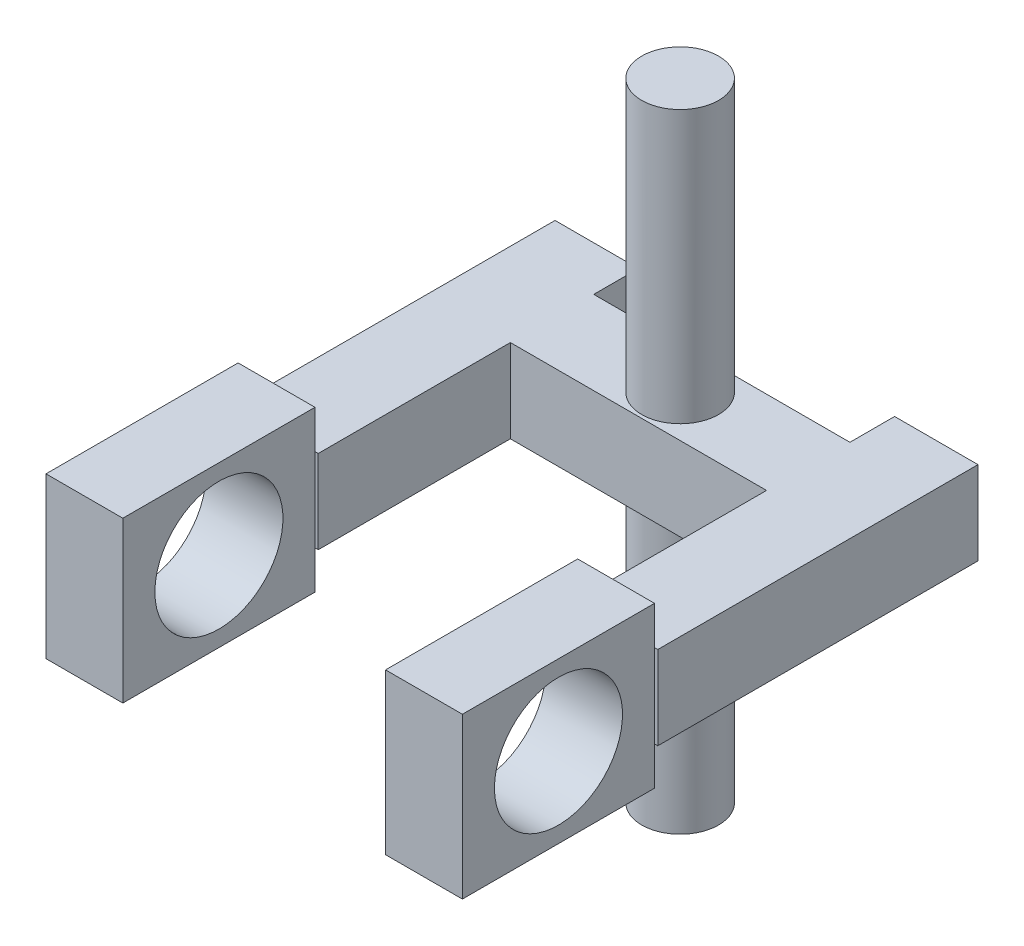
ISO-10303-21;
HEADER;
FILE_DESCRIPTION(('STEP AP214'),'2;1');
FILE_NAME('part.step','',(''),(''),'','','');
FILE_SCHEMA(('AUTOMOTIVE_DESIGN { 1 0 10303 214 1 1 1 1 }'));
ENDSEC;
DATA;
#1=APPLICATION_CONTEXT('core data for automotive mechanical design processes');
#2=APPLICATION_PROTOCOL_DEFINITION('international standard','automotive_design',2000,#1);
#3=PRODUCT_CONTEXT('',#1,'mechanical');
#4=PRODUCT('Part','Part','',(#3));
#5=PRODUCT_RELATED_PRODUCT_CATEGORY('part','',(#4));
#6=PRODUCT_DEFINITION_FORMATION('','',#4);
#7=PRODUCT_DEFINITION_CONTEXT('part definition',#1,'design');
#8=PRODUCT_DEFINITION('design','',#6,#7);
#9=PRODUCT_DEFINITION_SHAPE('','',#8);
#10=(LENGTH_UNIT() NAMED_UNIT(*) SI_UNIT(.MILLI.,.METRE.));
#11=(NAMED_UNIT(*) PLANE_ANGLE_UNIT() SI_UNIT($,.RADIAN.));
#12=(NAMED_UNIT(*) SI_UNIT($,.STERADIAN.) SOLID_ANGLE_UNIT());
#13=UNCERTAINTY_MEASURE_WITH_UNIT(LENGTH_MEASURE(1.E-05),#10,'distance_accuracy_value','');
#14=(GEOMETRIC_REPRESENTATION_CONTEXT(3) GLOBAL_UNCERTAINTY_ASSIGNED_CONTEXT((#13)) GLOBAL_UNIT_ASSIGNED_CONTEXT((#10,
#11,#12)) REPRESENTATION_CONTEXT('',''));
#15=CARTESIAN_POINT('',(0.,0.,0.));
#16=DIRECTION('',(0.,0.,1.));
#17=DIRECTION('',(1.,0.,0.));
#18=AXIS2_PLACEMENT_3D('',#15,#16,#17);
#19=CARTESIAN_POINT('',(0.,0.,36.511));
#20=DIRECTION('',(0.,0.,1.));
#21=DIRECTION('',(1.,0.,0.));
#22=AXIS2_PLACEMENT_3D('',#19,#20,#21);
#23=PLANE('',#22);
#24=DIRECTION('',(-1.,0.,0.));
#25=VECTOR('',#24,1.);
#26=CARTESIAN_POINT('',(20.,55.511,36.511));
#27=LINE('',#26,#25);
#28=CARTESIAN_POINT('',(33.022,55.511,36.511));
#29=VERTEX_POINT('',#28);
#30=CARTESIAN_POINT('',(32.511,55.511,36.511));
#31=VERTEX_POINT('',#30);
#32=EDGE_CURVE('E435',#29,#31,#27,.T.);
#33=ORIENTED_EDGE('',*,*,#32,.T.);
#34=DIRECTION('',(0.,-1.,0.));
#35=VECTOR('',#34,1.);
#36=CARTESIAN_POINT('',(32.511,0.,36.511));
#37=LINE('',#36,#35);
#38=CARTESIAN_POINT('',(32.511,42.489,36.511));
#39=VERTEX_POINT('',#38);
#40=EDGE_CURVE('E11',#31,#39,#37,.T.);
#41=ORIENTED_EDGE('',*,*,#40,.T.);
#42=DIRECTION('',(1.,0.,0.));
#43=VECTOR('',#42,1.);
#44=CARTESIAN_POINT('',(20.,42.489,36.511));
#45=LINE('',#44,#43);
#46=CARTESIAN_POINT('',(33.022,42.489,36.511));
#47=VERTEX_POINT('',#46);
#48=EDGE_CURVE('E424',#39,#47,#45,.T.);
#49=ORIENTED_EDGE('',*,*,#48,.T.);
#50=DIRECTION('',(0.,1.,0.));
#51=VECTOR('',#50,1.);
#52=CARTESIAN_POINT('',(33.022,55.511,36.511));
#53=LINE('',#52,#51);
#54=EDGE_CURVE('E429',#47,#29,#53,.T.);
#55=ORIENTED_EDGE('',*,*,#54,.T.);
#56=EDGE_LOOP('',(#33,#41,#49,#55));
#57=FACE_BOUND('',#56,.T.);
#58=ADVANCED_FACE('F41',(#57),#23,.T.);
#59=CARTESIAN_POINT('',(20.,42.489,36.511));
#60=VERTEX_POINT('',#59);
#61=CARTESIAN_POINT('',(20.511,42.489,36.511));
#62=VERTEX_POINT('',#61);
#63=EDGE_CURVE('E425',#60,#62,#45,.T.);
#64=ORIENTED_EDGE('',*,*,#63,.T.);
#65=DIRECTION('',(0.,1.,0.));
#66=VECTOR('',#65,1.);
#67=CARTESIAN_POINT('',(20.511,0.,36.511));
#68=LINE('',#67,#66);
#69=CARTESIAN_POINT('',(20.511,55.511,36.511));
#70=VERTEX_POINT('',#69);
#71=EDGE_CURVE('E51',#62,#70,#68,.T.);
#72=ORIENTED_EDGE('',*,*,#71,.T.);
#73=CARTESIAN_POINT('',(20.,55.511,36.511));
#74=VERTEX_POINT('',#73);
#75=EDGE_CURVE('E434',#70,#74,#27,.T.);
#76=ORIENTED_EDGE('',*,*,#75,.T.);
#77=DIRECTION('',(0.,-1.,0.));
#78=VECTOR('',#77,1.);
#79=CARTESIAN_POINT('',(20.,55.511,36.511));
#80=LINE('',#79,#78);
#81=EDGE_CURVE('E420',#74,#60,#80,.T.);
#82=ORIENTED_EDGE('',*,*,#81,.T.);
#83=EDGE_LOOP('',(#64,#72,#76,#82));
#84=FACE_BOUND('',#83,.T.);
#85=ADVANCED_FACE('F578',(#84),#23,.T.);
#86=CARTESIAN_POINT('',(0.,0.,36.511));
#87=DIRECTION('',(0.,0.,-1.));
#88=DIRECTION('',(-1.,0.,0.));
#89=AXIS2_PLACEMENT_3D('',#86,#87,#88);
#90=PLANE('',#89);
#91=DIRECTION('',(0.,1.,0.));
#92=VECTOR('',#91,1.);
#93=CARTESIAN_POINT('',(-20.511,0.,36.511));
#94=LINE('',#93,#92);
#95=CARTESIAN_POINT('',(-20.511,42.489,36.511));
#96=VERTEX_POINT('',#95);
#97=CARTESIAN_POINT('',(-20.511,55.511,36.511));
#98=VERTEX_POINT('',#97);
#99=EDGE_CURVE('E66',#96,#98,#94,.T.);
#100=ORIENTED_EDGE('',*,*,#99,.F.);
#101=DIRECTION('',(1.,0.,0.));
#102=VECTOR('',#101,1.);
#103=CARTESIAN_POINT('',(-20.,42.489,36.511));
#104=LINE('',#103,#102);
#105=CARTESIAN_POINT('',(-20.,42.489,36.511));
#106=VERTEX_POINT('',#105);
#107=EDGE_CURVE('E486',#96,#106,#104,.T.);
#108=ORIENTED_EDGE('',*,*,#107,.T.);
#109=DIRECTION('',(0.,1.,0.));
#110=VECTOR('',#109,1.);
#111=CARTESIAN_POINT('',(-20.,55.511,36.511));
#112=LINE('',#111,#110);
#113=CARTESIAN_POINT('',(-20.,55.511,36.511));
#114=VERTEX_POINT('',#113);
#115=EDGE_CURVE('E461',#106,#114,#112,.T.);
#116=ORIENTED_EDGE('',*,*,#115,.T.);
#117=DIRECTION('',(-1.,0.,0.));
#118=VECTOR('',#117,1.);
#119=CARTESIAN_POINT('',(-20.,55.511,36.511));
#120=LINE('',#119,#118);
#121=EDGE_CURVE('E478',#114,#98,#120,.T.);
#122=ORIENTED_EDGE('',*,*,#121,.T.);
#123=EDGE_LOOP('',(#100,#108,#116,#122));
#124=FACE_BOUND('',#123,.T.);
#125=ADVANCED_FACE('F713',(#124),#90,.F.);
#126=DIRECTION('',(0.,-1.,0.));
#127=VECTOR('',#126,1.);
#128=CARTESIAN_POINT('',(-32.511,0.,36.511));
#129=LINE('',#128,#127);
#130=CARTESIAN_POINT('',(-32.511,55.511,36.511));
#131=VERTEX_POINT('',#130);
#132=CARTESIAN_POINT('',(-32.511,42.489,36.511));
#133=VERTEX_POINT('',#132);
#134=EDGE_CURVE('E565',#131,#133,#129,.T.);
#135=ORIENTED_EDGE('',*,*,#134,.F.);
#136=CARTESIAN_POINT('',(-33.022,55.511,36.511));
#137=VERTEX_POINT('',#136);
#138=EDGE_CURVE('E477',#131,#137,#120,.T.);
#139=ORIENTED_EDGE('',*,*,#138,.T.);
#140=DIRECTION('',(0.,-1.,0.));
#141=VECTOR('',#140,1.);
#142=CARTESIAN_POINT('',(-33.022,55.511,36.511));
#143=LINE('',#142,#141);
#144=CARTESIAN_POINT('',(-33.022,42.489,36.511));
#145=VERTEX_POINT('',#144);
#146=EDGE_CURVE('E481',#137,#145,#143,.T.);
#147=ORIENTED_EDGE('',*,*,#146,.T.);
#148=EDGE_CURVE('E487',#145,#133,#104,.T.);
#149=ORIENTED_EDGE('',*,*,#148,.T.);
#150=EDGE_LOOP('',(#135,#139,#147,#149));
#151=FACE_BOUND('',#150,.T.);
#152=ADVANCED_FACE('F668',(#151),#90,.F.);
#153=CARTESIAN_POINT('',(31.962,43.549,-23.489));
#154=DIRECTION('',(1.,0.,0.));
#155=DIRECTION('',(0.,0.,-1.));
#156=AXIS2_PLACEMENT_3D('',#153,#154,#155);
#157=PLANE('',#156);
#158=DIRECTION('',(0.,1.,0.));
#159=VECTOR('',#158,1.);
#160=CARTESIAN_POINT('',(31.962,54.451,16.511));
#161=LINE('',#160,#159);
#162=CARTESIAN_POINT('',(31.962,43.549,16.511));
#163=VERTEX_POINT('',#162);
#164=CARTESIAN_POINT('',(31.962,54.451,16.511));
#165=VERTEX_POINT('',#164);
#166=EDGE_CURVE('E341',#163,#165,#161,.T.);
#167=ORIENTED_EDGE('',*,*,#166,.T.);
#168=DIRECTION('',(0.,0.,1.));
#169=VECTOR('',#168,1.);
#170=CARTESIAN_POINT('',(31.962,54.451,-23.489));
#171=LINE('',#170,#169);
#172=CARTESIAN_POINT('',(31.962,54.451,-13.489));
#173=VERTEX_POINT('',#172);
#174=EDGE_CURVE('E361',#173,#165,#171,.T.);
#175=ORIENTED_EDGE('',*,*,#174,.F.);
#176=DIRECTION('',(0.,1.,0.));
#177=VECTOR('',#176,1.);
#178=CARTESIAN_POINT('',(31.962,0.,-13.489));
#179=LINE('',#178,#177);
#180=CARTESIAN_POINT('',(31.962,43.549,-13.489));
#181=VERTEX_POINT('',#180);
#182=EDGE_CURVE('E403',#181,#173,#179,.T.);
#183=ORIENTED_EDGE('',*,*,#182,.F.);
#184=DIRECTION('',(0.,0.,1.));
#185=VECTOR('',#184,1.);
#186=CARTESIAN_POINT('',(31.962,43.549,-23.489));
#187=LINE('',#186,#185);
#188=EDGE_CURVE('E378',#181,#163,#187,.T.);
#189=ORIENTED_EDGE('',*,*,#188,.T.);
#190=EDGE_LOOP('',(#167,#175,#183,#189));
#191=FACE_BOUND('',#190,.T.);
#192=ADVANCED_FACE('F716',(#191),#157,.F.);
#193=CARTESIAN_POINT('',(21.06,43.549,-23.489));
#194=DIRECTION('',(0.,-1.,0.));
#195=DIRECTION('',(0.,0.,-1.));
#196=AXIS2_PLACEMENT_3D('',#193,#194,#195);
#197=PLANE('',#196);
#198=DIRECTION('',(1.,0.,0.));
#199=VECTOR('',#198,1.);
#200=CARTESIAN_POINT('',(21.06,43.549,16.511));
#201=LINE('',#200,#199);
#202=CARTESIAN_POINT('',(21.06,43.549,16.511));
#203=VERTEX_POINT('',#202);
#204=EDGE_CURVE('E338',#203,#163,#201,.T.);
#205=ORIENTED_EDGE('',*,*,#204,.T.);
#206=ORIENTED_EDGE('',*,*,#188,.F.);
#207=DIRECTION('',(1.,0.,0.));
#208=VECTOR('',#207,1.);
#209=CARTESIAN_POINT('',(0.,43.549,-13.489));
#210=LINE('',#209,#208);
#211=CARTESIAN_POINT('',(21.06,43.549,-13.489));
#212=VERTEX_POINT('',#211);
#213=EDGE_CURVE('E399',#212,#181,#210,.T.);
#214=ORIENTED_EDGE('',*,*,#213,.F.);
#215=DIRECTION('',(0.,0.,1.));
#216=VECTOR('',#215,1.);
#217=CARTESIAN_POINT('',(21.06,43.549,-23.489));
#218=LINE('',#217,#216);
#219=EDGE_CURVE('E382',#212,#203,#218,.T.);
#220=ORIENTED_EDGE('',*,*,#219,.T.);
#221=EDGE_LOOP('',(#205,#206,#214,#220));
#222=FACE_BOUND('',#221,.T.);
#223=ADVANCED_FACE('F1018',(#222),#197,.F.);
#224=CARTESIAN_POINT('',(21.06,43.549,-23.489));
#225=DIRECTION('',(-1.,0.,0.));
#226=DIRECTION('',(0.,0.,1.));
#227=AXIS2_PLACEMENT_3D('',#224,#225,#226);
#228=PLANE('',#227);
#229=DIRECTION('',(0.,-1.,0.));
#230=VECTOR('',#229,1.);
#231=CARTESIAN_POINT('',(21.06,54.451,16.511));
#232=LINE('',#231,#230);
#233=CARTESIAN_POINT('',(21.06,54.451,16.511));
#234=VERTEX_POINT('',#233);
#235=EDGE_CURVE('E335',#234,#203,#232,.T.);
#236=ORIENTED_EDGE('',*,*,#235,.T.);
#237=ORIENTED_EDGE('',*,*,#219,.F.);
#238=DIRECTION('',(0.,-1.,0.));
#239=VECTOR('',#238,1.);
#240=CARTESIAN_POINT('',(21.06,0.,-13.489));
#241=LINE('',#240,#239);
#242=CARTESIAN_POINT('',(21.06,54.451,-13.489));
#243=VERTEX_POINT('',#242);
#244=EDGE_CURVE('E395',#243,#212,#241,.T.);
#245=ORIENTED_EDGE('',*,*,#244,.F.);
#246=DIRECTION('',(0.,0.,1.));
#247=VECTOR('',#246,1.);
#248=CARTESIAN_POINT('',(21.06,54.451,-23.489));
#249=LINE('',#248,#247);
#250=EDGE_CURVE('E386',#243,#234,#249,.T.);
#251=ORIENTED_EDGE('',*,*,#250,.T.);
#252=EDGE_LOOP('',(#236,#237,#245,#251));
#253=FACE_BOUND('',#252,.T.);
#254=ADVANCED_FACE('F1025',(#253),#228,.F.);
#255=CARTESIAN_POINT('',(21.06,54.451,-23.489));
#256=DIRECTION('',(0.,1.,0.));
#257=DIRECTION('',(0.,0.,1.));
#258=AXIS2_PLACEMENT_3D('',#255,#256,#257);
#259=PLANE('',#258);
#260=DIRECTION('',(-1.,0.,0.));
#261=VECTOR('',#260,1.);
#262=CARTESIAN_POINT('',(21.06,54.451,16.511));
#263=LINE('',#262,#261);
#264=EDGE_CURVE('E345',#165,#234,#263,.T.);
#265=ORIENTED_EDGE('',*,*,#264,.T.);
#266=ORIENTED_EDGE('',*,*,#250,.F.);
#267=DIRECTION('',(-1.,0.,0.));
#268=VECTOR('',#267,1.);
#269=CARTESIAN_POINT('',(0.,54.451,-13.489));
#270=LINE('',#269,#268);
#271=EDGE_CURVE('E366',#173,#243,#270,.T.);
#272=ORIENTED_EDGE('',*,*,#271,.F.);
#273=ORIENTED_EDGE('',*,*,#174,.T.);
#274=EDGE_LOOP('',(#265,#266,#272,#273));
#275=FACE_BOUND('',#274,.T.);
#276=ADVANCED_FACE('F1033',(#275),#259,.F.);
#277=CARTESIAN_POINT('',(-21.06,43.549,-23.489));
#278=DIRECTION('',(1.,0.,0.));
#279=DIRECTION('',(0.,0.,-1.));
#280=AXIS2_PLACEMENT_3D('',#277,#278,#279);
#281=PLANE('',#280);
#282=DIRECTION('',(0.,1.,0.));
#283=VECTOR('',#282,1.);
#284=CARTESIAN_POINT('',(-21.06,54.451,16.511));
#285=LINE('',#284,#283);
#286=CARTESIAN_POINT('',(-21.06,43.549,16.511));
#287=VERTEX_POINT('',#286);
#288=CARTESIAN_POINT('',(-21.06,54.451,16.511));
#289=VERTEX_POINT('',#288);
#290=EDGE_CURVE('E354',#287,#289,#285,.T.);
#291=ORIENTED_EDGE('',*,*,#290,.T.);
#292=DIRECTION('',(0.,0.,1.));
#293=VECTOR('',#292,1.);
#294=CARTESIAN_POINT('',(-21.06,54.451,-23.489));
#295=LINE('',#294,#293);
#296=CARTESIAN_POINT('',(-21.06,54.451,-13.489));
#297=VERTEX_POINT('',#296);
#298=EDGE_CURVE('E375',#297,#289,#295,.T.);
#299=ORIENTED_EDGE('',*,*,#298,.F.);
#300=DIRECTION('',(0.,-1.,0.));
#301=VECTOR('',#300,1.);
#302=CARTESIAN_POINT('',(-21.06,0.,-13.489));
#303=LINE('',#302,#301);
#304=CARTESIAN_POINT('',(-21.06,43.549,-13.489));
#305=VERTEX_POINT('',#304);
#306=EDGE_CURVE('E417',#297,#305,#303,.T.);
#307=ORIENTED_EDGE('',*,*,#306,.T.);
#308=DIRECTION('',(0.,0.,1.));
#309=VECTOR('',#308,1.);
#310=CARTESIAN_POINT('',(-21.06,43.549,-23.489));
#311=LINE('',#310,#309);
#312=EDGE_CURVE('E362',#305,#287,#311,.T.);
#313=ORIENTED_EDGE('',*,*,#312,.T.);
#314=EDGE_LOOP('',(#291,#299,#307,#313));
#315=FACE_BOUND('',#314,.T.);
#316=ADVANCED_FACE('F1041',(#315),#281,.F.);
#317=CARTESIAN_POINT('',(-31.962,43.549,-23.489));
#318=DIRECTION('',(0.,-1.,0.));
#319=DIRECTION('',(0.,0.,-1.));
#320=AXIS2_PLACEMENT_3D('',#317,#318,#319);
#321=PLANE('',#320);
#322=DIRECTION('',(1.,0.,0.));
#323=VECTOR('',#322,1.);
#324=CARTESIAN_POINT('',(-31.962,43.549,16.511));
#325=LINE('',#324,#323);
#326=CARTESIAN_POINT('',(-31.962,43.549,16.511));
#327=VERTEX_POINT('',#326);
#328=EDGE_CURVE('E351',#327,#287,#325,.T.);
#329=ORIENTED_EDGE('',*,*,#328,.T.);
#330=ORIENTED_EDGE('',*,*,#312,.F.);
#331=DIRECTION('',(-1.,0.,0.));
#332=VECTOR('',#331,1.);
#333=CARTESIAN_POINT('',(0.,43.549,-13.489));
#334=LINE('',#333,#332);
#335=CARTESIAN_POINT('',(-31.962,43.549,-13.489));
#336=VERTEX_POINT('',#335);
#337=EDGE_CURVE('E414',#305,#336,#334,.T.);
#338=ORIENTED_EDGE('',*,*,#337,.T.);
#339=DIRECTION('',(0.,0.,1.));
#340=VECTOR('',#339,1.);
#341=CARTESIAN_POINT('',(-31.962,43.549,-23.489));
#342=LINE('',#341,#340);
#343=EDGE_CURVE('E367',#336,#327,#342,.T.);
#344=ORIENTED_EDGE('',*,*,#343,.T.);
#345=EDGE_LOOP('',(#329,#330,#338,#344));
#346=FACE_BOUND('',#345,.T.);
#347=ADVANCED_FACE('F1048',(#346),#321,.F.);
#348=CARTESIAN_POINT('',(-31.962,43.549,-23.489));
#349=DIRECTION('',(-1.,0.,0.));
#350=DIRECTION('',(0.,0.,1.));
#351=AXIS2_PLACEMENT_3D('',#348,#349,#350);
#352=PLANE('',#351);
#353=DIRECTION('',(0.,-1.,0.));
#354=VECTOR('',#353,1.);
#355=CARTESIAN_POINT('',(-31.962,54.451,16.511));
#356=LINE('',#355,#354);
#357=CARTESIAN_POINT('',(-31.962,54.451,16.511));
#358=VERTEX_POINT('',#357);
#359=EDGE_CURVE('E348',#358,#327,#356,.T.);
#360=ORIENTED_EDGE('',*,*,#359,.T.);
#361=ORIENTED_EDGE('',*,*,#343,.F.);
#362=DIRECTION('',(0.,1.,0.));
#363=VECTOR('',#362,1.);
#364=CARTESIAN_POINT('',(-31.962,0.,-13.489));
#365=LINE('',#364,#363);
#366=CARTESIAN_POINT('',(-31.962,54.451,-13.489));
#367=VERTEX_POINT('',#366);
#368=EDGE_CURVE('E410',#336,#367,#365,.T.);
#369=ORIENTED_EDGE('',*,*,#368,.T.);
#370=DIRECTION('',(0.,0.,1.));
#371=VECTOR('',#370,1.);
#372=CARTESIAN_POINT('',(-31.962,54.451,-23.489));
#373=LINE('',#372,#371);
#374=EDGE_CURVE('E371',#367,#358,#373,.T.);
#375=ORIENTED_EDGE('',*,*,#374,.T.);
#376=EDGE_LOOP('',(#360,#361,#369,#375));
#377=FACE_BOUND('',#376,.T.);
#378=ADVANCED_FACE('F776',(#377),#352,.F.);
#379=CARTESIAN_POINT('',(-31.962,54.451,-23.489));
#380=DIRECTION('',(0.,1.,0.));
#381=DIRECTION('',(0.,0.,1.));
#382=AXIS2_PLACEMENT_3D('',#379,#380,#381);
#383=PLANE('',#382);
#384=DIRECTION('',(-1.,0.,0.));
#385=VECTOR('',#384,1.);
#386=CARTESIAN_POINT('',(-31.962,54.451,16.511));
#387=LINE('',#386,#385);
#388=EDGE_CURVE('E358',#289,#358,#387,.T.);
#389=ORIENTED_EDGE('',*,*,#388,.T.);
#390=ORIENTED_EDGE('',*,*,#374,.F.);
#391=DIRECTION('',(1.,0.,0.));
#392=VECTOR('',#391,1.);
#393=CARTESIAN_POINT('',(0.,54.451,-13.489));
#394=LINE('',#393,#392);
#395=EDGE_CURVE('E407',#367,#297,#394,.T.);
#396=ORIENTED_EDGE('',*,*,#395,.T.);
#397=ORIENTED_EDGE('',*,*,#298,.T.);
#398=EDGE_LOOP('',(#389,#390,#396,#397));
#399=FACE_BOUND('',#398,.T.);
#400=ADVANCED_FACE('F769',(#399),#383,.F.);
#401=CARTESIAN_POINT('',(0.,98.,0.));
#402=DIRECTION('',(0.,-1.,0.));
#403=DIRECTION('',(0.,0.,-1.));
#404=AXIS2_PLACEMENT_3D('',#401,#402,#403);
#405=CYLINDRICAL_SURFACE('',#404,6.);
#406=CARTESIAN_POINT('',(0.,42.489,0.));
#407=DIRECTION('',(0.,-1.,0.));
#408=DIRECTION('',(0.,0.,-1.));
#409=AXIS2_PLACEMENT_3D('',#406,#407,#408);
#410=CIRCLE('',#409,6.);
#411=CARTESIAN_POINT('',(0.,42.489,-6.));
#412=VERTEX_POINT('',#411);
#413=EDGE_CURVE('E542',#412,#412,#410,.T.);
#414=ORIENTED_EDGE('',*,*,#413,.T.);
#415=EDGE_LOOP('',(#414));
#416=FACE_BOUND('',#415,.T.);
#417=CARTESIAN_POINT('',(0.,0.,0.));
#418=DIRECTION('',(0.,1.,0.));
#419=DIRECTION('',(0.,0.,1.));
#420=AXIS2_PLACEMENT_3D('',#417,#418,#419);
#421=CIRCLE('',#420,6.);
#422=CARTESIAN_POINT('',(0.,0.,6.));
#423=VERTEX_POINT('',#422);
#424=EDGE_CURVE('E558',#423,#423,#421,.T.);
#425=ORIENTED_EDGE('',*,*,#424,.T.);
#426=EDGE_LOOP('',(#425));
#427=FACE_BOUND('',#426,.T.);
#428=ADVANCED_FACE('F43',(#416,#427),#405,.T.);
#429=CARTESIAN_POINT('',(0.,0.,0.));
#430=DIRECTION('',(0.,1.,0.));
#431=DIRECTION('',(0.,0.,1.));
#432=AXIS2_PLACEMENT_3D('',#429,#430,#431);
#433=PLANE('',#432);
#434=ORIENTED_EDGE('',*,*,#424,.F.);
#435=EDGE_LOOP('',(#434));
#436=FACE_BOUND('',#435,.T.);
#437=ADVANCED_FACE('F756',(#436),#433,.F.);
#438=CARTESIAN_POINT('',(-20.,42.489,6.511));
#439=DIRECTION('',(0.,0.,1.));
#440=DIRECTION('',(1.,0.,0.));
#441=AXIS2_PLACEMENT_3D('',#438,#439,#440);
#442=PLANE('',#441);
#443=DIRECTION('',(1.,0.,0.));
#444=VECTOR('',#443,1.);
#445=CARTESIAN_POINT('',(-20.,55.511,6.511));
#446=LINE('',#445,#444);
#447=CARTESIAN_POINT('',(-20.,55.511,6.511));
#448=VERTEX_POINT('',#447);
#449=CARTESIAN_POINT('',(20.,55.511,6.511));
#450=VERTEX_POINT('',#449);
#451=EDGE_CURVE('E529',#448,#450,#446,.T.);
#452=ORIENTED_EDGE('',*,*,#451,.F.);
#453=DIRECTION('',(0.,1.,0.));
#454=VECTOR('',#453,1.);
#455=CARTESIAN_POINT('',(-20.,42.489,6.511));
#456=LINE('',#455,#454);
#457=CARTESIAN_POINT('',(-20.,42.489,6.511));
#458=VERTEX_POINT('',#457);
#459=EDGE_CURVE('E543',#458,#448,#456,.T.);
#460=ORIENTED_EDGE('',*,*,#459,.F.);
#461=DIRECTION('',(1.,0.,0.));
#462=VECTOR('',#461,1.);
#463=CARTESIAN_POINT('',(-20.,42.489,6.511));
#464=LINE('',#463,#462);
#465=CARTESIAN_POINT('',(20.,42.489,6.511));
#466=VERTEX_POINT('',#465);
#467=EDGE_CURVE('E528',#458,#466,#464,.T.);
#468=ORIENTED_EDGE('',*,*,#467,.T.);
#469=DIRECTION('',(0.,1.,0.));
#470=VECTOR('',#469,1.);
#471=CARTESIAN_POINT('',(20.,42.489,6.511));
#472=LINE('',#471,#470);
#473=EDGE_CURVE('E539',#466,#450,#472,.T.);
#474=ORIENTED_EDGE('',*,*,#473,.T.);
#475=EDGE_LOOP('',(#452,#460,#468,#474));
#476=FACE_BOUND('',#475,.T.);
#477=ADVANCED_FACE('F753',(#476),#442,.T.);
#478=CARTESIAN_POINT('',(-20.,42.489,-6.511));
#479=DIRECTION('',(0.,0.,-1.));
#480=DIRECTION('',(-1.,0.,0.));
#481=AXIS2_PLACEMENT_3D('',#478,#479,#480);
#482=PLANE('',#481);
#483=DIRECTION('',(-1.,0.,0.));
#484=VECTOR('',#483,1.);
#485=CARTESIAN_POINT('',(-20.,55.511,-6.511));
#486=LINE('',#485,#484);
#487=CARTESIAN_POINT('',(20.,55.511,-6.511));
#488=VERTEX_POINT('',#487);
#489=CARTESIAN_POINT('',(-20.,55.511,-6.511));
#490=VERTEX_POINT('',#489);
#491=EDGE_CURVE('E512',#488,#490,#486,.T.);
#492=ORIENTED_EDGE('',*,*,#491,.F.);
#493=DIRECTION('',(0.,1.,0.));
#494=VECTOR('',#493,1.);
#495=CARTESIAN_POINT('',(20.,42.489,-6.511));
#496=LINE('',#495,#494);
#497=CARTESIAN_POINT('',(20.,42.489,-6.511));
#498=VERTEX_POINT('',#497);
#499=EDGE_CURVE('E532',#498,#488,#496,.T.);
#500=ORIENTED_EDGE('',*,*,#499,.F.);
#501=DIRECTION('',(-1.,0.,0.));
#502=VECTOR('',#501,1.);
#503=CARTESIAN_POINT('',(-20.,42.489,-6.511));
#504=LINE('',#503,#502);
#505=CARTESIAN_POINT('',(-20.,42.489,-6.511));
#506=VERTEX_POINT('',#505);
#507=EDGE_CURVE('E525',#498,#506,#504,.T.);
#508=ORIENTED_EDGE('',*,*,#507,.T.);
#509=DIRECTION('',(0.,1.,0.));
#510=VECTOR('',#509,1.);
#511=CARTESIAN_POINT('',(-20.,42.489,-6.511));
#512=LINE('',#511,#510);
#513=EDGE_CURVE('E547',#506,#490,#512,.T.);
#514=ORIENTED_EDGE('',*,*,#513,.T.);
#515=EDGE_LOOP('',(#492,#500,#508,#514));
#516=FACE_BOUND('',#515,.T.);
#517=ADVANCED_FACE('F747',(#516),#482,.T.);
#518=CARTESIAN_POINT('',(0.,42.489,0.));
#519=DIRECTION('',(0.,-1.,0.));
#520=DIRECTION('',(0.,0.,-1.));
#521=AXIS2_PLACEMENT_3D('',#518,#519,#520);
#522=PLANE('',#521);
#523=ORIENTED_EDGE('',*,*,#413,.F.);
#524=EDGE_LOOP('',(#523));
#525=FACE_BOUND('',#524,.T.);
#526=ORIENTED_EDGE('',*,*,#507,.F.);
#527=DIRECTION('',(0.,0.,1.));
#528=VECTOR('',#527,1.);
#529=CARTESIAN_POINT('',(20.,42.489,-13.489));
#530=LINE('',#529,#528);
#531=CARTESIAN_POINT('',(20.,42.489,-13.489));
#532=VERTEX_POINT('',#531);
#533=EDGE_CURVE('E470',#532,#498,#530,.T.);
#534=ORIENTED_EDGE('',*,*,#533,.F.);
#535=DIRECTION('',(1.,0.,0.));
#536=VECTOR('',#535,1.);
#537=CARTESIAN_POINT('',(20.,42.489,-13.489));
#538=LINE('',#537,#536);
#539=CARTESIAN_POINT('',(33.022,42.489,-13.489));
#540=VERTEX_POINT('',#539);
#541=EDGE_CURVE('E444',#532,#540,#538,.T.);
#542=ORIENTED_EDGE('',*,*,#541,.T.);
#543=DIRECTION('',(0.,0.,1.));
#544=VECTOR('',#543,1.);
#545=CARTESIAN_POINT('',(33.022,42.489,-13.489));
#546=LINE('',#545,#544);
#547=EDGE_CURVE('E466',#540,#47,#546,.T.);
#548=ORIENTED_EDGE('',*,*,#547,.T.);
#549=ORIENTED_EDGE('',*,*,#48,.F.);
#550=EDGE_CURVE('E430',#62,#39,#45,.T.);
#551=ORIENTED_EDGE('',*,*,#550,.F.);
#552=ORIENTED_EDGE('',*,*,#63,.F.);
#553=EDGE_CURVE('E456',#466,#60,#530,.T.);
#554=ORIENTED_EDGE('',*,*,#553,.F.);
#555=ORIENTED_EDGE('',*,*,#467,.F.);
#556=DIRECTION('',(0.,0.,1.));
#557=VECTOR('',#556,1.);
#558=CARTESIAN_POINT('',(-20.,42.489,-13.489));
#559=LINE('',#558,#557);
#560=EDGE_CURVE('E513',#458,#106,#559,.T.);
#561=ORIENTED_EDGE('',*,*,#560,.T.);
#562=ORIENTED_EDGE('',*,*,#107,.F.);
#563=EDGE_CURVE('E491',#133,#96,#104,.T.);
#564=ORIENTED_EDGE('',*,*,#563,.F.);
#565=ORIENTED_EDGE('',*,*,#148,.F.);
#566=DIRECTION('',(0.,0.,1.));
#567=VECTOR('',#566,1.);
#568=CARTESIAN_POINT('',(-33.022,42.489,-13.489));
#569=LINE('',#568,#567);
#570=CARTESIAN_POINT('',(-33.022,42.489,-13.489));
#571=VERTEX_POINT('',#570);
#572=EDGE_CURVE('E514',#571,#145,#569,.T.);
#573=ORIENTED_EDGE('',*,*,#572,.F.);
#574=DIRECTION('',(1.,0.,0.));
#575=VECTOR('',#574,1.);
#576=CARTESIAN_POINT('',(-20.,42.489,-13.489));
#577=LINE('',#576,#575);
#578=CARTESIAN_POINT('',(-20.,42.489,-13.489));
#579=VERTEX_POINT('',#578);
#580=EDGE_CURVE('E503',#571,#579,#577,.T.);
#581=ORIENTED_EDGE('',*,*,#580,.T.);
#582=EDGE_CURVE('E508',#579,#506,#559,.T.);
#583=ORIENTED_EDGE('',*,*,#582,.T.);
#584=EDGE_LOOP('',(#526,#534,#542,#548,#549,#551,#552,#554,#555,#561,#562,#564,#565,#573,#581,#583));
#585=FACE_BOUND('',#584,.T.);
#586=ADVANCED_FACE('F602',(#525,#585),#522,.T.);
#587=CARTESIAN_POINT('',(0.,55.511,0.));
#588=DIRECTION('',(0.,-1.,0.));
#589=DIRECTION('',(0.,0.,-1.));
#590=AXIS2_PLACEMENT_3D('',#587,#588,#589);
#591=PLANE('',#590);
#592=CARTESIAN_POINT('',(0.,55.511,0.));
#593=DIRECTION('',(0.,-1.,0.));
#594=DIRECTION('',(0.,0.,-1.));
#595=AXIS2_PLACEMENT_3D('',#592,#593,#594);
#596=CIRCLE('',#595,6.);
#597=CARTESIAN_POINT('',(0.,55.511,-6.));
#598=VERTEX_POINT('',#597);
#599=EDGE_CURVE('E557',#598,#598,#596,.T.);
#600=ORIENTED_EDGE('',*,*,#599,.T.);
#601=EDGE_LOOP('',(#600));
#602=FACE_BOUND('',#601,.T.);
#603=ORIENTED_EDGE('',*,*,#451,.T.);
#604=DIRECTION('',(0.,0.,1.));
#605=VECTOR('',#604,1.);
#606=CARTESIAN_POINT('',(20.,55.511,-13.489));
#607=LINE('',#606,#605);
#608=EDGE_CURVE('E462',#450,#74,#607,.T.);
#609=ORIENTED_EDGE('',*,*,#608,.T.);
#610=ORIENTED_EDGE('',*,*,#75,.F.);
#611=EDGE_CURVE('E440',#31,#70,#27,.T.);
#612=ORIENTED_EDGE('',*,*,#611,.F.);
#613=ORIENTED_EDGE('',*,*,#32,.F.);
#614=DIRECTION('',(0.,0.,1.));
#615=VECTOR('',#614,1.);
#616=CARTESIAN_POINT('',(33.022,55.511,-13.489));
#617=LINE('',#616,#615);
#618=CARTESIAN_POINT('',(33.022,55.511,-13.489));
#619=VERTEX_POINT('',#618);
#620=EDGE_CURVE('E463',#619,#29,#617,.T.);
#621=ORIENTED_EDGE('',*,*,#620,.F.);
#622=DIRECTION('',(-1.,0.,0.));
#623=VECTOR('',#622,1.);
#624=CARTESIAN_POINT('',(20.,55.511,-13.489));
#625=LINE('',#624,#623);
#626=CARTESIAN_POINT('',(20.,55.511,-13.489));
#627=VERTEX_POINT('',#626);
#628=EDGE_CURVE('E452',#619,#627,#625,.T.);
#629=ORIENTED_EDGE('',*,*,#628,.T.);
#630=EDGE_CURVE('E457',#627,#488,#607,.T.);
#631=ORIENTED_EDGE('',*,*,#630,.T.);
#632=ORIENTED_EDGE('',*,*,#491,.T.);
#633=DIRECTION('',(0.,0.,1.));
#634=VECTOR('',#633,1.);
#635=CARTESIAN_POINT('',(-20.,55.511,-13.489));
#636=LINE('',#635,#634);
#637=CARTESIAN_POINT('',(-20.,55.511,-13.489));
#638=VERTEX_POINT('',#637);
#639=EDGE_CURVE('E521',#638,#490,#636,.T.);
#640=ORIENTED_EDGE('',*,*,#639,.F.);
#641=DIRECTION('',(-1.,0.,0.));
#642=VECTOR('',#641,1.);
#643=CARTESIAN_POINT('',(-20.,55.511,-13.489));
#644=LINE('',#643,#642);
#645=CARTESIAN_POINT('',(-33.022,55.511,-13.489));
#646=VERTEX_POINT('',#645);
#647=EDGE_CURVE('E495',#638,#646,#644,.T.);
#648=ORIENTED_EDGE('',*,*,#647,.T.);
#649=DIRECTION('',(0.,0.,1.));
#650=VECTOR('',#649,1.);
#651=CARTESIAN_POINT('',(-33.022,55.511,-13.489));
#652=LINE('',#651,#650);
#653=EDGE_CURVE('E517',#646,#137,#652,.T.);
#654=ORIENTED_EDGE('',*,*,#653,.T.);
#655=ORIENTED_EDGE('',*,*,#138,.F.);
#656=EDGE_CURVE('E482',#98,#131,#120,.T.);
#657=ORIENTED_EDGE('',*,*,#656,.F.);
#658=ORIENTED_EDGE('',*,*,#121,.F.);
#659=EDGE_CURVE('E507',#448,#114,#636,.T.);
#660=ORIENTED_EDGE('',*,*,#659,.F.);
#661=EDGE_LOOP('',(#603,#609,#610,#612,#613,#621,#629,#631,#632,#640,#648,#654,#655,#657,#658,#660));
#662=FACE_BOUND('',#661,.T.);
#663=ADVANCED_FACE('F584',(#602,#662),#591,.F.);
#664=CARTESIAN_POINT('',(0.,98.,0.));
#665=DIRECTION('',(0.,1.,0.));
#666=DIRECTION('',(0.,0.,1.));
#667=AXIS2_PLACEMENT_3D('',#664,#665,#666);
#668=PLANE('',#667);
#669=CARTESIAN_POINT('',(0.,98.,0.));
#670=DIRECTION('',(0.,1.,0.));
#671=DIRECTION('',(0.,0.,1.));
#672=AXIS2_PLACEMENT_3D('',#669,#670,#671);
#673=CIRCLE('',#672,6.);
#674=CARTESIAN_POINT('',(0.,98.,6.));
#675=VERTEX_POINT('',#674);
#676=EDGE_CURVE('E553',#675,#675,#673,.T.);
#677=ORIENTED_EDGE('',*,*,#676,.T.);
#678=EDGE_LOOP('',(#677));
#679=FACE_BOUND('',#678,.T.);
#680=ADVANCED_FACE('F751',(#679),#668,.T.);
#681=ORIENTED_EDGE('',*,*,#676,.F.);
#682=EDGE_LOOP('',(#681));
#683=FACE_BOUND('',#682,.T.);
#684=ORIENTED_EDGE('',*,*,#599,.F.);
#685=EDGE_LOOP('',(#684));
#686=FACE_BOUND('',#685,.T.);
#687=ADVANCED_FACE('F762',(#683,#686),#405,.T.);
#688=CARTESIAN_POINT('',(-20.,55.511,-13.489));
#689=DIRECTION('',(1.,0.,0.));
#690=DIRECTION('',(0.,0.,-1.));
#691=AXIS2_PLACEMENT_3D('',#688,#689,#690);
#692=PLANE('',#691);
#693=ORIENTED_EDGE('',*,*,#513,.F.);
#694=ORIENTED_EDGE('',*,*,#582,.F.);
#695=DIRECTION('',(0.,1.,0.));
#696=VECTOR('',#695,1.);
#697=CARTESIAN_POINT('',(-20.,55.511,-13.489));
#698=LINE('',#697,#696);
#699=EDGE_CURVE('E490',#579,#638,#698,.T.);
#700=ORIENTED_EDGE('',*,*,#699,.T.);
#701=ORIENTED_EDGE('',*,*,#639,.T.);
#702=EDGE_LOOP('',(#693,#694,#700,#701));
#703=FACE_BOUND('',#702,.T.);
#704=ADVANCED_FACE('F743',(#703),#692,.T.);
#705=ORIENTED_EDGE('',*,*,#560,.F.);
#706=ORIENTED_EDGE('',*,*,#459,.T.);
#707=ORIENTED_EDGE('',*,*,#659,.T.);
#708=ORIENTED_EDGE('',*,*,#115,.F.);
#709=EDGE_LOOP('',(#705,#706,#707,#708));
#710=FACE_BOUND('',#709,.T.);
#711=ADVANCED_FACE('F740',(#710),#692,.T.);
#712=CARTESIAN_POINT('',(-33.022,55.511,-13.489));
#713=DIRECTION('',(-1.,0.,0.));
#714=DIRECTION('',(0.,-1.,0.));
#715=AXIS2_PLACEMENT_3D('',#712,#713,#714);
#716=PLANE('',#715);
#717=ORIENTED_EDGE('',*,*,#572,.T.);
#718=ORIENTED_EDGE('',*,*,#146,.F.);
#719=ORIENTED_EDGE('',*,*,#653,.F.);
#720=DIRECTION('',(0.,-1.,0.));
#721=VECTOR('',#720,1.);
#722=CARTESIAN_POINT('',(-33.022,55.511,-13.489));
#723=LINE('',#722,#721);
#724=EDGE_CURVE('E499',#646,#571,#723,.T.);
#725=ORIENTED_EDGE('',*,*,#724,.T.);
#726=EDGE_LOOP('',(#717,#718,#719,#725));
#727=FACE_BOUND('',#726,.T.);
#728=ADVANCED_FACE('F674',(#727),#716,.T.);
#729=CARTESIAN_POINT('',(0.,0.,-13.489));
#730=DIRECTION('',(0.,0.,-1.));
#731=DIRECTION('',(-1.,0.,0.));
#732=AXIS2_PLACEMENT_3D('',#729,#730,#731);
#733=PLANE('',#732);
#734=ORIENTED_EDGE('',*,*,#306,.F.);
#735=ORIENTED_EDGE('',*,*,#395,.F.);
#736=ORIENTED_EDGE('',*,*,#368,.F.);
#737=ORIENTED_EDGE('',*,*,#337,.F.);
#738=EDGE_LOOP('',(#734,#735,#736,#737));
#739=FACE_BOUND('',#738,.T.);
#740=ORIENTED_EDGE('',*,*,#699,.F.);
#741=ORIENTED_EDGE('',*,*,#580,.F.);
#742=ORIENTED_EDGE('',*,*,#724,.F.);
#743=ORIENTED_EDGE('',*,*,#647,.F.);
#744=EDGE_LOOP('',(#740,#741,#742,#743));
#745=FACE_BOUND('',#744,.T.);
#746=ADVANCED_FACE('F734',(#739,#745),#733,.T.);
#747=CARTESIAN_POINT('',(20.,55.511,-13.489));
#748=DIRECTION('',(-1.,0.,0.));
#749=DIRECTION('',(0.,0.,1.));
#750=AXIS2_PLACEMENT_3D('',#747,#748,#749);
#751=PLANE('',#750);
#752=ORIENTED_EDGE('',*,*,#473,.F.);
#753=ORIENTED_EDGE('',*,*,#553,.T.);
#754=ORIENTED_EDGE('',*,*,#81,.F.);
#755=ORIENTED_EDGE('',*,*,#608,.F.);
#756=EDGE_LOOP('',(#752,#753,#754,#755));
#757=FACE_BOUND('',#756,.T.);
#758=ADVANCED_FACE('F730',(#757),#751,.T.);
#759=ORIENTED_EDGE('',*,*,#533,.T.);
#760=ORIENTED_EDGE('',*,*,#499,.T.);
#761=ORIENTED_EDGE('',*,*,#630,.F.);
#762=DIRECTION('',(0.,-1.,0.));
#763=VECTOR('',#762,1.);
#764=CARTESIAN_POINT('',(20.,55.511,-13.489));
#765=LINE('',#764,#763);
#766=EDGE_CURVE('E439',#627,#532,#765,.T.);
#767=ORIENTED_EDGE('',*,*,#766,.T.);
#768=EDGE_LOOP('',(#759,#760,#761,#767));
#769=FACE_BOUND('',#768,.T.);
#770=ADVANCED_FACE('F726',(#769),#751,.T.);
#771=CARTESIAN_POINT('',(33.022,55.511,-13.489));
#772=DIRECTION('',(1.,0.,0.));
#773=DIRECTION('',(0.,1.,0.));
#774=AXIS2_PLACEMENT_3D('',#771,#772,#773);
#775=PLANE('',#774);
#776=ORIENTED_EDGE('',*,*,#620,.T.);
#777=ORIENTED_EDGE('',*,*,#54,.F.);
#778=ORIENTED_EDGE('',*,*,#547,.F.);
#779=DIRECTION('',(0.,1.,0.));
#780=VECTOR('',#779,1.);
#781=CARTESIAN_POINT('',(33.022,55.511,-13.489));
#782=LINE('',#781,#780);
#783=EDGE_CURVE('E448',#540,#619,#782,.T.);
#784=ORIENTED_EDGE('',*,*,#783,.T.);
#785=EDGE_LOOP('',(#776,#777,#778,#784));
#786=FACE_BOUND('',#785,.T.);
#787=ADVANCED_FACE('F722',(#786),#775,.T.);
#788=CARTESIAN_POINT('',(0.,0.,-13.489));
#789=DIRECTION('',(0.,0.,1.));
#790=DIRECTION('',(1.,0.,0.));
#791=AXIS2_PLACEMENT_3D('',#788,#789,#790);
#792=PLANE('',#791);
#793=ORIENTED_EDGE('',*,*,#213,.T.);
#794=ORIENTED_EDGE('',*,*,#182,.T.);
#795=ORIENTED_EDGE('',*,*,#271,.T.);
#796=ORIENTED_EDGE('',*,*,#244,.T.);
#797=EDGE_LOOP('',(#793,#794,#795,#796));
#798=FACE_BOUND('',#797,.T.);
#799=ORIENTED_EDGE('',*,*,#766,.F.);
#800=ORIENTED_EDGE('',*,*,#628,.F.);
#801=ORIENTED_EDGE('',*,*,#783,.F.);
#802=ORIENTED_EDGE('',*,*,#541,.F.);
#803=EDGE_LOOP('',(#799,#800,#801,#802));
#804=FACE_BOUND('',#803,.T.);
#805=ADVANCED_FACE('F718',(#798,#804),#792,.F.);
#806=CARTESIAN_POINT('',(0.,0.,16.511));
#807=DIRECTION('',(0.,0.,1.));
#808=DIRECTION('',(1.,0.,0.));
#809=AXIS2_PLACEMENT_3D('',#806,#807,#808);
#810=PLANE('',#809);
#811=ORIENTED_EDGE('',*,*,#359,.F.);
#812=ORIENTED_EDGE('',*,*,#388,.F.);
#813=ORIENTED_EDGE('',*,*,#290,.F.);
#814=ORIENTED_EDGE('',*,*,#328,.F.);
#815=EDGE_LOOP('',(#811,#812,#813,#814));
#816=FACE_BOUND('',#815,.T.);
#817=ADVANCED_FACE('F721',(#816),#810,.F.);
#818=CARTESIAN_POINT('',(0.,0.,16.511));
#819=DIRECTION('',(0.,0.,1.));
#820=DIRECTION('',(1.,0.,0.));
#821=AXIS2_PLACEMENT_3D('',#818,#819,#820);
#822=PLANE('',#821);
#823=ORIENTED_EDGE('',*,*,#235,.F.);
#824=ORIENTED_EDGE('',*,*,#264,.F.);
#825=ORIENTED_EDGE('',*,*,#166,.F.);
#826=ORIENTED_EDGE('',*,*,#204,.F.);
#827=EDGE_LOOP('',(#823,#824,#825,#826));
#828=FACE_BOUND('',#827,.T.);
#829=ADVANCED_FACE('F705',(#828),#822,.F.);
#830=CARTESIAN_POINT('',(0.,0.,36.511));
#831=DIRECTION('',(0.,0.,-1.));
#832=DIRECTION('',(-1.,0.,0.));
#833=AXIS2_PLACEMENT_3D('',#830,#831,#832);
#834=PLANE('',#833);
#835=ORIENTED_EDGE('',*,*,#656,.T.);
#836=DIRECTION('',(0.,-1.,0.));
#837=VECTOR('',#836,1.);
#838=CARTESIAN_POINT('',(-32.511,36.5,36.511));
#839=LINE('',#838,#837);
#840=CARTESIAN_POINT('',(-32.511,61.5,36.511));
#841=VERTEX_POINT('',#840);
#842=EDGE_CURVE('E314',#841,#131,#839,.T.);
#843=ORIENTED_EDGE('',*,*,#842,.F.);
#844=DIRECTION('',(-1.,0.,0.));
#845=VECTOR('',#844,1.);
#846=CARTESIAN_POINT('',(-32.511,61.5,36.511));
#847=LINE('',#846,#845);
#848=CARTESIAN_POINT('',(-20.511,61.5,36.511));
#849=VERTEX_POINT('',#848);
#850=EDGE_CURVE('E310',#849,#841,#847,.T.);
#851=ORIENTED_EDGE('',*,*,#850,.F.);
#852=DIRECTION('',(0.,1.,0.));
#853=VECTOR('',#852,1.);
#854=CARTESIAN_POINT('',(-20.511,36.5,36.511));
#855=LINE('',#854,#853);
#856=EDGE_CURVE('E283',#98,#849,#855,.T.);
#857=ORIENTED_EDGE('',*,*,#856,.F.);
#858=EDGE_LOOP('',(#835,#843,#851,#857));
#859=FACE_BOUND('',#858,.T.);
#860=ADVANCED_FACE('F661',(#859),#834,.T.);
#861=CARTESIAN_POINT('',(-20.511,36.5,66.511));
#862=DIRECTION('',(-1.,0.,0.));
#863=DIRECTION('',(0.,0.,1.));
#864=AXIS2_PLACEMENT_3D('',#861,#862,#863);
#865=PLANE('',#864);
#866=CARTESIAN_POINT('',(-20.511,49.,51.511));
#867=DIRECTION('',(-1.,0.,0.));
#868=DIRECTION('',(0.,0.,1.));
#869=AXIS2_PLACEMENT_3D('',#866,#867,#868);
#870=CIRCLE('',#869,10.);
#871=CARTESIAN_POINT('',(-20.511,49.,61.511));
#872=VERTEX_POINT('',#871);
#873=EDGE_CURVE('E595',#872,#872,#870,.T.);
#874=ORIENTED_EDGE('',*,*,#873,.T.);
#875=EDGE_LOOP('',(#874));
#876=FACE_BOUND('',#875,.T.);
#877=CARTESIAN_POINT('',(-20.511,36.5,36.511));
#878=VERTEX_POINT('',#877);
#879=EDGE_CURVE('E287',#878,#96,#855,.T.);
#880=ORIENTED_EDGE('',*,*,#879,.T.);
#881=ORIENTED_EDGE('',*,*,#99,.T.);
#882=ORIENTED_EDGE('',*,*,#856,.T.);
#883=DIRECTION('',(0.,0.,-1.));
#884=VECTOR('',#883,1.);
#885=CARTESIAN_POINT('',(-20.511,61.5,66.511));
#886=LINE('',#885,#884);
#887=CARTESIAN_POINT('',(-20.511,61.5,66.511));
#888=VERTEX_POINT('',#887);
#889=EDGE_CURVE('E331',#888,#849,#886,.T.);
#890=ORIENTED_EDGE('',*,*,#889,.F.);
#891=DIRECTION('',(0.,1.,0.));
#892=VECTOR('',#891,1.);
#893=CARTESIAN_POINT('',(-20.511,36.5,66.511));
#894=LINE('',#893,#892);
#895=CARTESIAN_POINT('',(-20.511,36.5,66.511));
#896=VERTEX_POINT('',#895);
#897=EDGE_CURVE('E293',#896,#888,#894,.T.);
#898=ORIENTED_EDGE('',*,*,#897,.F.);
#899=DIRECTION('',(0.,0.,-1.));
#900=VECTOR('',#899,1.);
#901=CARTESIAN_POINT('',(-20.511,36.5,66.511));
#902=LINE('',#901,#900);
#903=EDGE_CURVE('E306',#896,#878,#902,.T.);
#904=ORIENTED_EDGE('',*,*,#903,.T.);
#905=EDGE_LOOP('',(#880,#881,#882,#890,#898,#904));
#906=FACE_BOUND('',#905,.T.);
#907=ADVANCED_FACE('F696',(#876,#906),#865,.F.);
#908=CARTESIAN_POINT('',(-32.511,61.5,66.511));
#909=DIRECTION('',(0.,-1.,0.));
#910=DIRECTION('',(0.,0.,-1.));
#911=AXIS2_PLACEMENT_3D('',#908,#909,#910);
#912=PLANE('',#911);
#913=ORIENTED_EDGE('',*,*,#850,.T.);
#914=DIRECTION('',(0.,0.,-1.));
#915=VECTOR('',#914,1.);
#916=CARTESIAN_POINT('',(-32.511,61.5,66.511));
#917=LINE('',#916,#915);
#918=CARTESIAN_POINT('',(-32.511,61.5,66.511));
#919=VERTEX_POINT('',#918);
#920=EDGE_CURVE('E327',#919,#841,#917,.T.);
#921=ORIENTED_EDGE('',*,*,#920,.F.);
#922=DIRECTION('',(-1.,0.,0.));
#923=VECTOR('',#922,1.);
#924=CARTESIAN_POINT('',(-32.511,61.5,66.511));
#925=LINE('',#924,#923);
#926=EDGE_CURVE('E297',#888,#919,#925,.T.);
#927=ORIENTED_EDGE('',*,*,#926,.F.);
#928=ORIENTED_EDGE('',*,*,#889,.T.);
#929=EDGE_LOOP('',(#913,#921,#927,#928));
#930=FACE_BOUND('',#929,.T.);
#931=ADVANCED_FACE('F653',(#930),#912,.F.);
#932=CARTESIAN_POINT('',(-32.511,36.5,66.511));
#933=DIRECTION('',(1.,0.,0.));
#934=DIRECTION('',(0.,0.,-1.));
#935=AXIS2_PLACEMENT_3D('',#932,#933,#934);
#936=PLANE('',#935);
#937=CARTESIAN_POINT('',(-32.511,49.,51.511));
#938=DIRECTION('',(-1.,0.,0.));
#939=DIRECTION('',(0.,0.,1.));
#940=AXIS2_PLACEMENT_3D('',#937,#938,#939);
#941=CIRCLE('',#940,10.);
#942=CARTESIAN_POINT('',(-32.511,49.,61.511));
#943=VERTEX_POINT('',#942);
#944=EDGE_CURVE('E641',#943,#943,#941,.T.);
#945=ORIENTED_EDGE('',*,*,#944,.F.);
#946=EDGE_LOOP('',(#945));
#947=FACE_BOUND('',#946,.T.);
#948=ORIENTED_EDGE('',*,*,#842,.T.);
#949=ORIENTED_EDGE('',*,*,#134,.T.);
#950=CARTESIAN_POINT('',(-32.511,36.5,36.511));
#951=VERTEX_POINT('',#950);
#952=EDGE_CURVE('E313',#133,#951,#839,.T.);
#953=ORIENTED_EDGE('',*,*,#952,.T.);
#954=DIRECTION('',(0.,0.,-1.));
#955=VECTOR('',#954,1.);
#956=CARTESIAN_POINT('',(-32.511,36.5,66.511));
#957=LINE('',#956,#955);
#958=CARTESIAN_POINT('',(-32.511,36.5,66.511));
#959=VERTEX_POINT('',#958);
#960=EDGE_CURVE('E323',#959,#951,#957,.T.);
#961=ORIENTED_EDGE('',*,*,#960,.F.);
#962=DIRECTION('',(0.,-1.,0.));
#963=VECTOR('',#962,1.);
#964=CARTESIAN_POINT('',(-32.511,36.5,66.511));
#965=LINE('',#964,#963);
#966=EDGE_CURVE('E301',#919,#959,#965,.T.);
#967=ORIENTED_EDGE('',*,*,#966,.F.);
#968=ORIENTED_EDGE('',*,*,#920,.T.);
#969=EDGE_LOOP('',(#948,#949,#953,#961,#967,#968));
#970=FACE_BOUND('',#969,.T.);
#971=ADVANCED_FACE('F649',(#947,#970),#936,.F.);
#972=CARTESIAN_POINT('',(-32.511,36.5,66.511));
#973=DIRECTION('',(0.,1.,0.));
#974=DIRECTION('',(0.,0.,1.));
#975=AXIS2_PLACEMENT_3D('',#972,#973,#974);
#976=PLANE('',#975);
#977=DIRECTION('',(1.,0.,0.));
#978=VECTOR('',#977,1.);
#979=CARTESIAN_POINT('',(-32.511,36.5,36.511));
#980=LINE('',#979,#978);
#981=EDGE_CURVE('E298',#951,#878,#980,.T.);
#982=ORIENTED_EDGE('',*,*,#981,.T.);
#983=ORIENTED_EDGE('',*,*,#903,.F.);
#984=DIRECTION('',(1.,0.,0.));
#985=VECTOR('',#984,1.);
#986=CARTESIAN_POINT('',(-32.511,36.5,66.511));
#987=LINE('',#986,#985);
#988=EDGE_CURVE('E304',#959,#896,#987,.T.);
#989=ORIENTED_EDGE('',*,*,#988,.F.);
#990=ORIENTED_EDGE('',*,*,#960,.T.);
#991=EDGE_LOOP('',(#982,#983,#989,#990));
#992=FACE_BOUND('',#991,.T.);
#993=ADVANCED_FACE('F652',(#992),#976,.F.);
#994=CARTESIAN_POINT('',(0.,0.,66.511));
#995=DIRECTION('',(0.,0.,-1.));
#996=DIRECTION('',(-1.,0.,0.));
#997=AXIS2_PLACEMENT_3D('',#994,#995,#996);
#998=PLANE('',#997);
#999=ORIENTED_EDGE('',*,*,#897,.T.);
#1000=ORIENTED_EDGE('',*,*,#926,.T.);
#1001=ORIENTED_EDGE('',*,*,#966,.T.);
#1002=ORIENTED_EDGE('',*,*,#988,.T.);
#1003=EDGE_LOOP('',(#999,#1000,#1001,#1002));
#1004=FACE_BOUND('',#1003,.T.);
#1005=ADVANCED_FACE('F692',(#1004),#998,.F.);
#1006=ORIENTED_EDGE('',*,*,#952,.F.);
#1007=ORIENTED_EDGE('',*,*,#563,.T.);
#1008=ORIENTED_EDGE('',*,*,#879,.F.);
#1009=ORIENTED_EDGE('',*,*,#981,.F.);
#1010=EDGE_LOOP('',(#1006,#1007,#1008,#1009));
#1011=FACE_BOUND('',#1010,.T.);
#1012=ADVANCED_FACE('F684',(#1011),#834,.T.);
#1013=CARTESIAN_POINT('',(0.,0.,36.511));
#1014=DIRECTION('',(0.,0.,-1.));
#1015=DIRECTION('',(-1.,0.,0.));
#1016=AXIS2_PLACEMENT_3D('',#1013,#1014,#1015);
#1017=PLANE('',#1016);
#1018=ORIENTED_EDGE('',*,*,#611,.T.);
#1019=DIRECTION('',(0.,-1.,0.));
#1020=VECTOR('',#1019,1.);
#1021=CARTESIAN_POINT('',(20.511,36.5,36.511));
#1022=LINE('',#1021,#1020);
#1023=CARTESIAN_POINT('',(20.511,61.5,36.511));
#1024=VERTEX_POINT('',#1023);
#1025=EDGE_CURVE('E58',#1024,#70,#1022,.T.);
#1026=ORIENTED_EDGE('',*,*,#1025,.F.);
#1027=DIRECTION('',(-1.,0.,0.));
#1028=VECTOR('',#1027,1.);
#1029=CARTESIAN_POINT('',(20.511,61.5,36.511));
#1030=LINE('',#1029,#1028);
#1031=CARTESIAN_POINT('',(32.511,61.5,36.511));
#1032=VERTEX_POINT('',#1031);
#1033=EDGE_CURVE('E592',#1032,#1024,#1030,.T.);
#1034=ORIENTED_EDGE('',*,*,#1033,.F.);
#1035=DIRECTION('',(0.,1.,0.));
#1036=VECTOR('',#1035,1.);
#1037=CARTESIAN_POINT('',(32.511,36.5,36.511));
#1038=LINE('',#1037,#1036);
#1039=EDGE_CURVE('E280',#31,#1032,#1038,.T.);
#1040=ORIENTED_EDGE('',*,*,#1039,.F.);
#1041=EDGE_LOOP('',(#1018,#1026,#1034,#1040));
#1042=FACE_BOUND('',#1041,.T.);
#1043=ADVANCED_FACE('F591',(#1042),#1017,.T.);
#1044=CARTESIAN_POINT('',(32.511,36.5,66.511));
#1045=DIRECTION('',(-1.,0.,0.));
#1046=DIRECTION('',(0.,0.,1.));
#1047=AXIS2_PLACEMENT_3D('',#1044,#1045,#1046);
#1048=PLANE('',#1047);
#1049=CARTESIAN_POINT('',(32.511,49.,51.511));
#1050=DIRECTION('',(-1.,0.,0.));
#1051=DIRECTION('',(0.,0.,1.));
#1052=AXIS2_PLACEMENT_3D('',#1049,#1050,#1051);
#1053=CIRCLE('',#1052,10.);
#1054=CARTESIAN_POINT('',(32.511,49.,61.511));
#1055=VERTEX_POINT('',#1054);
#1056=EDGE_CURVE('E634',#1055,#1055,#1053,.T.);
#1057=ORIENTED_EDGE('',*,*,#1056,.T.);
#1058=EDGE_LOOP('',(#1057));
#1059=FACE_BOUND('',#1058,.T.);
#1060=CARTESIAN_POINT('',(32.511,36.5,36.511));
#1061=VERTEX_POINT('',#1060);
#1062=EDGE_CURVE('E594',#1061,#39,#1038,.T.);
#1063=ORIENTED_EDGE('',*,*,#1062,.T.);
#1064=ORIENTED_EDGE('',*,*,#40,.F.);
#1065=ORIENTED_EDGE('',*,*,#1039,.T.);
#1066=DIRECTION('',(0.,0.,-1.));
#1067=VECTOR('',#1066,1.);
#1068=CARTESIAN_POINT('',(32.511,61.5,66.511));
#1069=LINE('',#1068,#1067);
#1070=CARTESIAN_POINT('',(32.511,61.5,66.511));
#1071=VERTEX_POINT('',#1070);
#1072=EDGE_CURVE('E259',#1071,#1032,#1069,.T.);
#1073=ORIENTED_EDGE('',*,*,#1072,.F.);
#1074=DIRECTION('',(0.,1.,0.));
#1075=VECTOR('',#1074,1.);
#1076=CARTESIAN_POINT('',(32.511,36.5,66.511));
#1077=LINE('',#1076,#1075);
#1078=CARTESIAN_POINT('',(32.511,36.5,66.511));
#1079=VERTEX_POINT('',#1078);
#1080=EDGE_CURVE('E265',#1079,#1071,#1077,.T.);
#1081=ORIENTED_EDGE('',*,*,#1080,.F.);
#1082=DIRECTION('',(0.,0.,-1.));
#1083=VECTOR('',#1082,1.);
#1084=CARTESIAN_POINT('',(32.511,36.5,66.511));
#1085=LINE('',#1084,#1083);
#1086=EDGE_CURVE('E620',#1079,#1061,#1085,.T.);
#1087=ORIENTED_EDGE('',*,*,#1086,.T.);
#1088=EDGE_LOOP('',(#1063,#1064,#1065,#1073,#1081,#1087));
#1089=FACE_BOUND('',#1088,.T.);
#1090=ADVANCED_FACE('F278',(#1059,#1089),#1048,.F.);
#1091=CARTESIAN_POINT('',(20.511,61.5,66.511));
#1092=DIRECTION('',(0.,-1.,0.));
#1093=DIRECTION('',(0.,0.,-1.));
#1094=AXIS2_PLACEMENT_3D('',#1091,#1092,#1093);
#1095=PLANE('',#1094);
#1096=ORIENTED_EDGE('',*,*,#1033,.T.);
#1097=DIRECTION('',(0.,0.,-1.));
#1098=VECTOR('',#1097,1.);
#1099=CARTESIAN_POINT('',(20.511,61.5,66.511));
#1100=LINE('',#1099,#1098);
#1101=CARTESIAN_POINT('',(20.511,61.5,66.511));
#1102=VERTEX_POINT('',#1101);
#1103=EDGE_CURVE('E260',#1102,#1024,#1100,.T.);
#1104=ORIENTED_EDGE('',*,*,#1103,.F.);
#1105=DIRECTION('',(-1.,0.,0.));
#1106=VECTOR('',#1105,1.);
#1107=CARTESIAN_POINT('',(20.511,61.5,66.511));
#1108=LINE('',#1107,#1106);
#1109=EDGE_CURVE('E255',#1071,#1102,#1108,.T.);
#1110=ORIENTED_EDGE('',*,*,#1109,.F.);
#1111=ORIENTED_EDGE('',*,*,#1072,.T.);
#1112=EDGE_LOOP('',(#1096,#1104,#1110,#1111));
#1113=FACE_BOUND('',#1112,.T.);
#1114=ADVANCED_FACE('F257',(#1113),#1095,.F.);
#1115=CARTESIAN_POINT('',(20.511,36.5,66.511));
#1116=DIRECTION('',(1.,0.,0.));
#1117=DIRECTION('',(0.,0.,-1.));
#1118=AXIS2_PLACEMENT_3D('',#1115,#1116,#1117);
#1119=PLANE('',#1118);
#1120=CARTESIAN_POINT('',(20.511,49.,51.511));
#1121=DIRECTION('',(1.,0.,0.));
#1122=DIRECTION('',(0.,0.,-1.));
#1123=AXIS2_PLACEMENT_3D('',#1120,#1121,#1122);
#1124=CIRCLE('',#1123,10.);
#1125=CARTESIAN_POINT('',(20.511,49.,41.511));
#1126=VERTEX_POINT('',#1125);
#1127=EDGE_CURVE('E45',#1126,#1126,#1124,.T.);
#1128=ORIENTED_EDGE('',*,*,#1127,.T.);
#1129=EDGE_LOOP('',(#1128));
#1130=FACE_BOUND('',#1129,.T.);
#1131=ORIENTED_EDGE('',*,*,#1025,.T.);
#1132=ORIENTED_EDGE('',*,*,#71,.F.);
#1133=CARTESIAN_POINT('',(20.511,36.5,36.511));
#1134=VERTEX_POINT('',#1133);
#1135=EDGE_CURVE('E609',#62,#1134,#1022,.T.);
#1136=ORIENTED_EDGE('',*,*,#1135,.T.);
#1137=DIRECTION('',(0.,0.,-1.));
#1138=VECTOR('',#1137,1.);
#1139=CARTESIAN_POINT('',(20.511,36.5,66.511));
#1140=LINE('',#1139,#1138);
#1141=CARTESIAN_POINT('',(20.511,36.5,66.511));
#1142=VERTEX_POINT('',#1141);
#1143=EDGE_CURVE('E289',#1142,#1134,#1140,.T.);
#1144=ORIENTED_EDGE('',*,*,#1143,.F.);
#1145=DIRECTION('',(0.,-1.,0.));
#1146=VECTOR('',#1145,1.);
#1147=CARTESIAN_POINT('',(20.511,36.5,66.511));
#1148=LINE('',#1147,#1146);
#1149=EDGE_CURVE('E264',#1102,#1142,#1148,.T.);
#1150=ORIENTED_EDGE('',*,*,#1149,.F.);
#1151=ORIENTED_EDGE('',*,*,#1103,.T.);
#1152=EDGE_LOOP('',(#1131,#1132,#1136,#1144,#1150,#1151));
#1153=FACE_BOUND('',#1152,.T.);
#1154=ADVANCED_FACE('F625',(#1130,#1153),#1119,.F.);
#1155=CARTESIAN_POINT('',(20.511,36.5,66.511));
#1156=DIRECTION('',(0.,1.,0.));
#1157=DIRECTION('',(0.,0.,1.));
#1158=AXIS2_PLACEMENT_3D('',#1155,#1156,#1157);
#1159=PLANE('',#1158);
#1160=DIRECTION('',(1.,0.,0.));
#1161=VECTOR('',#1160,1.);
#1162=CARTESIAN_POINT('',(20.511,36.5,36.511));
#1163=LINE('',#1162,#1161);
#1164=EDGE_CURVE('E275',#1134,#1061,#1163,.T.);
#1165=ORIENTED_EDGE('',*,*,#1164,.T.);
#1166=ORIENTED_EDGE('',*,*,#1086,.F.);
#1167=DIRECTION('',(1.,0.,0.));
#1168=VECTOR('',#1167,1.);
#1169=CARTESIAN_POINT('',(20.511,36.5,66.511));
#1170=LINE('',#1169,#1168);
#1171=EDGE_CURVE('E270',#1142,#1079,#1170,.T.);
#1172=ORIENTED_EDGE('',*,*,#1171,.F.);
#1173=ORIENTED_EDGE('',*,*,#1143,.T.);
#1174=EDGE_LOOP('',(#1165,#1166,#1172,#1173));
#1175=FACE_BOUND('',#1174,.T.);
#1176=ADVANCED_FACE('F624',(#1175),#1159,.F.);
#1177=CARTESIAN_POINT('',(0.,0.,66.511));
#1178=DIRECTION('',(0.,0.,-1.));
#1179=DIRECTION('',(-1.,0.,0.));
#1180=AXIS2_PLACEMENT_3D('',#1177,#1178,#1179);
#1181=PLANE('',#1180);
#1182=ORIENTED_EDGE('',*,*,#1080,.T.);
#1183=ORIENTED_EDGE('',*,*,#1109,.T.);
#1184=ORIENTED_EDGE('',*,*,#1149,.T.);
#1185=ORIENTED_EDGE('',*,*,#1171,.T.);
#1186=EDGE_LOOP('',(#1182,#1183,#1184,#1185));
#1187=FACE_BOUND('',#1186,.T.);
#1188=ADVANCED_FACE('F268',(#1187),#1181,.F.);
#1189=ORIENTED_EDGE('',*,*,#1135,.F.);
#1190=ORIENTED_EDGE('',*,*,#550,.T.);
#1191=ORIENTED_EDGE('',*,*,#1062,.F.);
#1192=ORIENTED_EDGE('',*,*,#1164,.F.);
#1193=EDGE_LOOP('',(#1189,#1190,#1191,#1192));
#1194=FACE_BOUND('',#1193,.T.);
#1195=ADVANCED_FACE('F607',(#1194),#1017,.T.);
#1196=CARTESIAN_POINT('',(67.489,49.,51.511));
#1197=DIRECTION('',(-1.,0.,0.));
#1198=DIRECTION('',(0.,0.,1.));
#1199=AXIS2_PLACEMENT_3D('',#1196,#1197,#1198);
#1200=CYLINDRICAL_SURFACE('',#1199,10.);
#1201=ORIENTED_EDGE('',*,*,#1127,.F.);
#1202=EDGE_LOOP('',(#1201));
#1203=FACE_BOUND('',#1202,.T.);
#1204=ORIENTED_EDGE('',*,*,#1056,.F.);
#1205=EDGE_LOOP('',(#1204));
#1206=FACE_BOUND('',#1205,.T.);
#1207=ADVANCED_FACE('F928',(#1203,#1206),#1200,.F.);
#1208=ORIENTED_EDGE('',*,*,#944,.T.);
#1209=EDGE_LOOP('',(#1208));
#1210=FACE_BOUND('',#1209,.T.);
#1211=ORIENTED_EDGE('',*,*,#873,.F.);
#1212=EDGE_LOOP('',(#1211));
#1213=FACE_BOUND('',#1212,.T.);
#1214=ADVANCED_FACE('F646',(#1210,#1213),#1200,.F.);
#1215=CLOSED_SHELL('',(#58,#85,#125,#152,#192,#223,#254,#276,#316,#347,#378,#400,#428,#437,#477,
#517,#586,#663,#680,#687,#704,#711,#728,#746,#758,#770,#787,#805,#817,#829,#860,#907,#931,#971,
#993,#1005,#1012,#1043,#1090,#1114,#1154,#1176,#1188,#1195,#1207,#1214));
#1216=MANIFOLD_SOLID_BREP('B2',#1215);
#1217=ADVANCED_BREP_SHAPE_REPRESENTATION('',(#18,#1216),#14);
#1218=SHAPE_DEFINITION_REPRESENTATION(#9,#1217);
ENDSEC;
END-ISO-10303-21;
